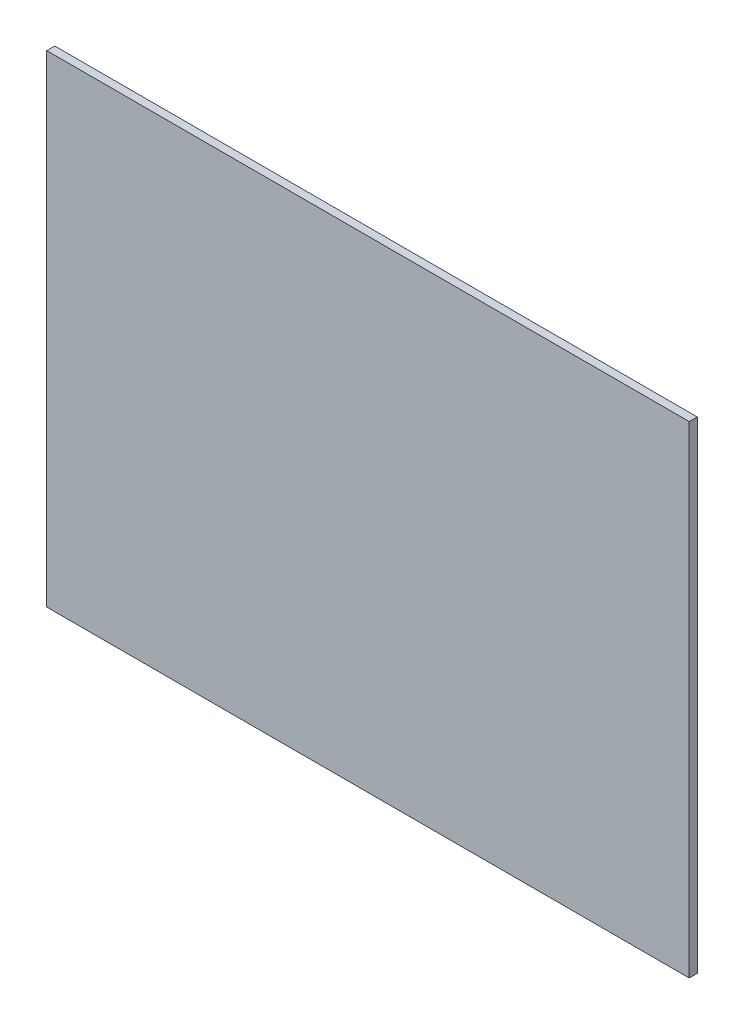
ISO-10303-21;
HEADER;
FILE_DESCRIPTION(('STEP AP214'),'2;1');
FILE_NAME('part.step','',(''),(''),'','','');
FILE_SCHEMA(('AUTOMOTIVE_DESIGN { 1 0 10303 214 1 1 1 1 }'));
ENDSEC;
DATA;
#1=APPLICATION_CONTEXT('core data for automotive mechanical design processes');
#2=APPLICATION_PROTOCOL_DEFINITION('international standard','automotive_design',2000,#1);
#3=PRODUCT_CONTEXT('',#1,'mechanical');
#4=PRODUCT('Part','Part','',(#3));
#5=PRODUCT_RELATED_PRODUCT_CATEGORY('part','',(#4));
#6=PRODUCT_DEFINITION_FORMATION('','',#4);
#7=PRODUCT_DEFINITION_CONTEXT('part definition',#1,'design');
#8=PRODUCT_DEFINITION('design','',#6,#7);
#9=PRODUCT_DEFINITION_SHAPE('','',#8);
#10=(LENGTH_UNIT() NAMED_UNIT(*) SI_UNIT(.MILLI.,.METRE.));
#11=(NAMED_UNIT(*) PLANE_ANGLE_UNIT() SI_UNIT($,.RADIAN.));
#12=(NAMED_UNIT(*) SI_UNIT($,.STERADIAN.) SOLID_ANGLE_UNIT());
#13=UNCERTAINTY_MEASURE_WITH_UNIT(LENGTH_MEASURE(1.E-05),#10,'distance_accuracy_value','');
#14=(GEOMETRIC_REPRESENTATION_CONTEXT(3) GLOBAL_UNCERTAINTY_ASSIGNED_CONTEXT((#13)) GLOBAL_UNIT_ASSIGNED_CONTEXT((#10,
#11,#12)) REPRESENTATION_CONTEXT('',''));
#15=CARTESIAN_POINT('',(0.,0.,0.));
#16=DIRECTION('',(0.,0.,1.));
#17=DIRECTION('',(1.,0.,0.));
#18=AXIS2_PLACEMENT_3D('',#15,#16,#17);
#19=CARTESIAN_POINT('',(0.,0.,10.));
#20=DIRECTION('',(1.,0.,0.));
#21=DIRECTION('',(0.,1.,0.));
#22=AXIS2_PLACEMENT_3D('',#19,#20,#21);
#23=PLANE('',#22);
#24=DIRECTION('',(0.,-1.,0.));
#25=VECTOR('',#24,1.);
#26=CARTESIAN_POINT('',(0.,0.,0.));
#27=LINE('',#26,#25);
#28=CARTESIAN_POINT('',(0.,0.,0.));
#29=VERTEX_POINT('',#28);
#30=CARTESIAN_POINT('',(0.,-600.,0.));
#31=VERTEX_POINT('',#30);
#32=EDGE_CURVE('E98',#29,#31,#27,.T.);
#33=ORIENTED_EDGE('',*,*,#32,.T.);
#34=DIRECTION('',(0.,0.,-1.));
#35=VECTOR('',#34,1.);
#36=CARTESIAN_POINT('',(0.,-600.,10.));
#37=LINE('',#36,#35);
#38=CARTESIAN_POINT('',(0.,-600.,10.));
#39=VERTEX_POINT('',#38);
#40=EDGE_CURVE('E11',#39,#31,#37,.T.);
#41=ORIENTED_EDGE('',*,*,#40,.F.);
#42=DIRECTION('',(0.,-1.,0.));
#43=VECTOR('',#42,1.);
#44=CARTESIAN_POINT('',(0.,0.,10.));
#45=LINE('',#44,#43);
#46=CARTESIAN_POINT('',(0.,0.,10.));
#47=VERTEX_POINT('',#46);
#48=EDGE_CURVE('E86',#47,#39,#45,.T.);
#49=ORIENTED_EDGE('',*,*,#48,.F.);
#50=DIRECTION('',(0.,0.,-1.));
#51=VECTOR('',#50,1.);
#52=CARTESIAN_POINT('',(0.,0.,10.));
#53=LINE('',#52,#51);
#54=EDGE_CURVE('E94',#47,#29,#53,.T.);
#55=ORIENTED_EDGE('',*,*,#54,.T.);
#56=EDGE_LOOP('',(#33,#41,#49,#55));
#57=FACE_BOUND('',#56,.T.);
#58=ADVANCED_FACE('F35',(#57),#23,.F.);
#59=CARTESIAN_POINT('',(0.,-600.,10.));
#60=DIRECTION('',(0.,1.,0.));
#61=DIRECTION('',(0.,0.,1.));
#62=AXIS2_PLACEMENT_3D('',#59,#60,#61);
#63=PLANE('',#62);
#64=DIRECTION('',(1.,0.,0.));
#65=VECTOR('',#64,1.);
#66=CARTESIAN_POINT('',(0.,-600.,0.));
#67=LINE('',#66,#65);
#68=CARTESIAN_POINT('',(800.,-600.,0.));
#69=VERTEX_POINT('',#68);
#70=EDGE_CURVE('E90',#31,#69,#67,.T.);
#71=ORIENTED_EDGE('',*,*,#70,.T.);
#72=DIRECTION('',(0.,0.,-1.));
#73=VECTOR('',#72,1.);
#74=CARTESIAN_POINT('',(800.,-600.,10.));
#75=LINE('',#74,#73);
#76=CARTESIAN_POINT('',(800.,-600.,10.));
#77=VERTEX_POINT('',#76);
#78=EDGE_CURVE('E43',#77,#69,#75,.T.);
#79=ORIENTED_EDGE('',*,*,#78,.F.);
#80=DIRECTION('',(1.,0.,0.));
#81=VECTOR('',#80,1.);
#82=CARTESIAN_POINT('',(0.,-600.,10.));
#83=LINE('',#82,#81);
#84=EDGE_CURVE('E81',#39,#77,#83,.T.);
#85=ORIENTED_EDGE('',*,*,#84,.F.);
#86=ORIENTED_EDGE('',*,*,#40,.T.);
#87=EDGE_LOOP('',(#71,#79,#85,#86));
#88=FACE_BOUND('',#87,.T.);
#89=ADVANCED_FACE('F89',(#88),#63,.F.);
#90=CARTESIAN_POINT('',(800.,0.,10.));
#91=DIRECTION('',(-1.,0.,0.));
#92=DIRECTION('',(0.,-1.,0.));
#93=AXIS2_PLACEMENT_3D('',#90,#91,#92);
#94=PLANE('',#93);
#95=DIRECTION('',(0.,1.,0.));
#96=VECTOR('',#95,1.);
#97=CARTESIAN_POINT('',(800.,0.,0.));
#98=LINE('',#97,#96);
#99=CARTESIAN_POINT('',(800.,0.,0.));
#100=VERTEX_POINT('',#99);
#101=EDGE_CURVE('E68',#69,#100,#98,.T.);
#102=ORIENTED_EDGE('',*,*,#101,.T.);
#103=DIRECTION('',(0.,0.,-1.));
#104=VECTOR('',#103,1.);
#105=CARTESIAN_POINT('',(800.,0.,10.));
#106=LINE('',#105,#104);
#107=CARTESIAN_POINT('',(800.,0.,10.));
#108=VERTEX_POINT('',#107);
#109=EDGE_CURVE('E91',#108,#100,#106,.T.);
#110=ORIENTED_EDGE('',*,*,#109,.F.);
#111=DIRECTION('',(0.,1.,0.));
#112=VECTOR('',#111,1.);
#113=CARTESIAN_POINT('',(800.,0.,10.));
#114=LINE('',#113,#112);
#115=EDGE_CURVE('E84',#77,#108,#114,.T.);
#116=ORIENTED_EDGE('',*,*,#115,.F.);
#117=ORIENTED_EDGE('',*,*,#78,.T.);
#118=EDGE_LOOP('',(#102,#110,#116,#117));
#119=FACE_BOUND('',#118,.T.);
#120=ADVANCED_FACE('F92',(#119),#94,.F.);
#121=CARTESIAN_POINT('',(0.,0.,10.));
#122=DIRECTION('',(0.,-1.,0.));
#123=DIRECTION('',(0.,0.,-1.));
#124=AXIS2_PLACEMENT_3D('',#121,#122,#123);
#125=PLANE('',#124);
#126=DIRECTION('',(-1.,0.,0.));
#127=VECTOR('',#126,1.);
#128=CARTESIAN_POINT('',(0.,0.,0.));
#129=LINE('',#128,#127);
#130=EDGE_CURVE('E74',#100,#29,#129,.T.);
#131=ORIENTED_EDGE('',*,*,#130,.T.);
#132=ORIENTED_EDGE('',*,*,#54,.F.);
#133=DIRECTION('',(-1.,0.,0.));
#134=VECTOR('',#133,1.);
#135=CARTESIAN_POINT('',(0.,0.,10.));
#136=LINE('',#135,#134);
#137=EDGE_CURVE('E51',#108,#47,#136,.T.);
#138=ORIENTED_EDGE('',*,*,#137,.F.);
#139=ORIENTED_EDGE('',*,*,#109,.T.);
#140=EDGE_LOOP('',(#131,#132,#138,#139));
#141=FACE_BOUND('',#140,.T.);
#142=ADVANCED_FACE('F105',(#141),#125,.F.);
#143=CARTESIAN_POINT('',(0.,0.,10.));
#144=DIRECTION('',(0.,0.,1.));
#145=DIRECTION('',(1.,0.,0.));
#146=AXIS2_PLACEMENT_3D('',#143,#144,#145);
#147=PLANE('',#146);
#148=ORIENTED_EDGE('',*,*,#48,.T.);
#149=ORIENTED_EDGE('',*,*,#84,.T.);
#150=ORIENTED_EDGE('',*,*,#115,.T.);
#151=ORIENTED_EDGE('',*,*,#137,.T.);
#152=EDGE_LOOP('',(#148,#149,#150,#151));
#153=FACE_BOUND('',#152,.T.);
#154=ADVANCED_FACE('F82',(#153),#147,.T.);
#155=CARTESIAN_POINT('',(0.,0.,0.));
#156=DIRECTION('',(0.,0.,1.));
#157=DIRECTION('',(1.,0.,0.));
#158=AXIS2_PLACEMENT_3D('',#155,#156,#157);
#159=PLANE('',#158);
#160=ORIENTED_EDGE('',*,*,#32,.F.);
#161=ORIENTED_EDGE('',*,*,#130,.F.);
#162=ORIENTED_EDGE('',*,*,#101,.F.);
#163=ORIENTED_EDGE('',*,*,#70,.F.);
#164=EDGE_LOOP('',(#160,#161,#162,#163));
#165=FACE_BOUND('',#164,.T.);
#166=ADVANCED_FACE('F108',(#165),#159,.F.);
#167=CLOSED_SHELL('',(#58,#89,#120,#142,#154,#166));
#168=MANIFOLD_SOLID_BREP('B2',#167);
#169=ADVANCED_BREP_SHAPE_REPRESENTATION('',(#18,#168),#14);
#170=SHAPE_DEFINITION_REPRESENTATION(#9,#169);
ENDSEC;
END-ISO-10303-21;
